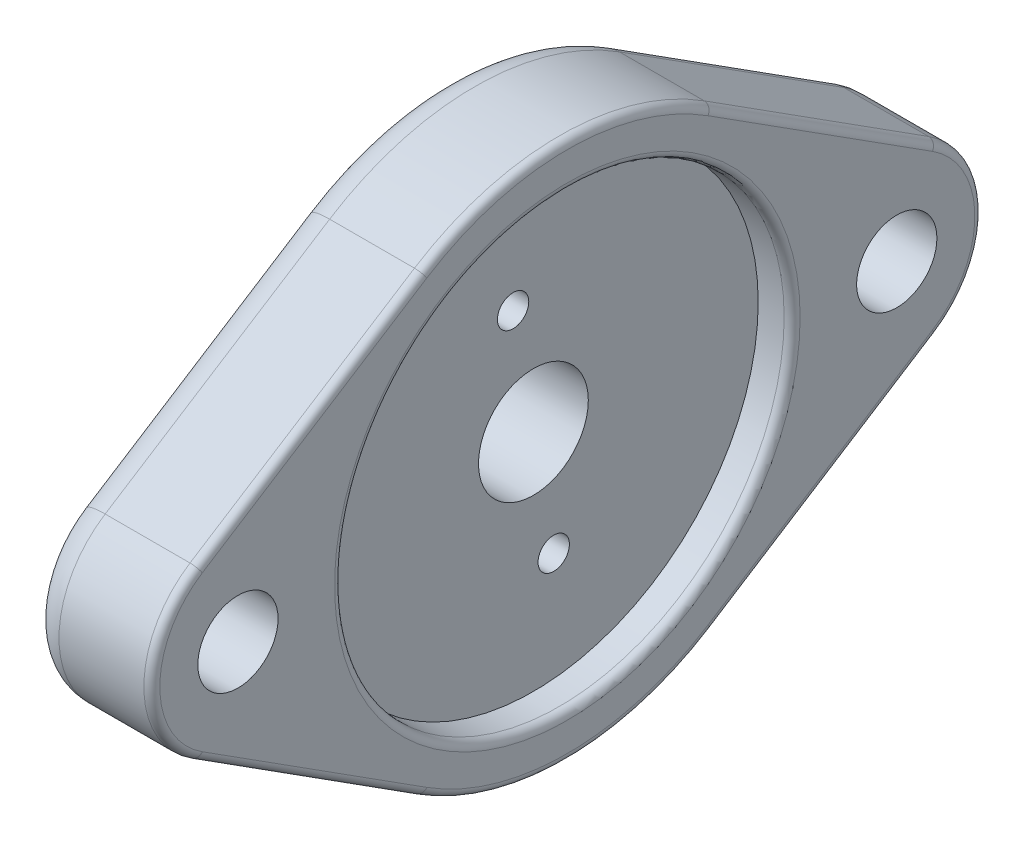
ISO-10303-21;
HEADER;
FILE_DESCRIPTION(('STEP AP214'),'2;1');
FILE_NAME('part.step','',(''),(''),'','','');
FILE_SCHEMA(('AUTOMOTIVE_DESIGN { 1 0 10303 214 1 1 1 1 }'));
ENDSEC;
DATA;
#1=APPLICATION_CONTEXT('core data for automotive mechanical design processes');
#2=APPLICATION_PROTOCOL_DEFINITION('international standard','automotive_design',2000,#1);
#3=PRODUCT_CONTEXT('',#1,'mechanical');
#4=PRODUCT('Part','Part','',(#3));
#5=PRODUCT_RELATED_PRODUCT_CATEGORY('part','',(#4));
#6=PRODUCT_DEFINITION_FORMATION('','',#4);
#7=PRODUCT_DEFINITION_CONTEXT('part definition',#1,'design');
#8=PRODUCT_DEFINITION('design','',#6,#7);
#9=PRODUCT_DEFINITION_SHAPE('','',#8);
#10=(LENGTH_UNIT() NAMED_UNIT(*) SI_UNIT(.MILLI.,.METRE.));
#11=(NAMED_UNIT(*) PLANE_ANGLE_UNIT() SI_UNIT($,.RADIAN.));
#12=(NAMED_UNIT(*) SI_UNIT($,.STERADIAN.) SOLID_ANGLE_UNIT());
#13=UNCERTAINTY_MEASURE_WITH_UNIT(LENGTH_MEASURE(1.E-05),#10,'distance_accuracy_value','');
#14=(GEOMETRIC_REPRESENTATION_CONTEXT(3) GLOBAL_UNCERTAINTY_ASSIGNED_CONTEXT((#13)) GLOBAL_UNIT_ASSIGNED_CONTEXT((#10,
#11,#12)) REPRESENTATION_CONTEXT('',''));
#15=CARTESIAN_POINT('',(0.,0.,0.));
#16=DIRECTION('',(0.,0.,1.));
#17=DIRECTION('',(1.,0.,0.));
#18=AXIS2_PLACEMENT_3D('',#15,#16,#17);
#19=CARTESIAN_POINT('',(0.,0.,0.));
#20=DIRECTION('',(1.,0.,0.));
#21=DIRECTION('',(0.,0.,-1.));
#22=AXIS2_PLACEMENT_3D('',#19,#20,#21);
#23=CYLINDRICAL_SURFACE('',#22,3.4925);
#24=CARTESIAN_POINT('',(0.,0.,0.));
#25=DIRECTION('',(1.,0.,0.));
#26=DIRECTION('',(0.,0.,-1.));
#27=AXIS2_PLACEMENT_3D('',#24,#25,#26);
#28=CIRCLE('',#27,3.4925);
#29=CARTESIAN_POINT('',(0.,0.,-3.4925));
#30=VERTEX_POINT('',#29);
#31=EDGE_CURVE('E314',#30,#30,#28,.T.);
#32=ORIENTED_EDGE('',*,*,#31,.F.);
#33=EDGE_LOOP('',(#32));
#34=FACE_BOUND('',#33,.T.);
#35=CARTESIAN_POINT('',(5.7785,0.,0.));
#36=DIRECTION('',(1.,0.,0.));
#37=DIRECTION('',(0.,0.,-1.));
#38=AXIS2_PLACEMENT_3D('',#35,#36,#37);
#39=CIRCLE('',#38,3.4925);
#40=CARTESIAN_POINT('',(5.7785,0.,-3.4925));
#41=VERTEX_POINT('',#40);
#42=EDGE_CURVE('E186',#41,#41,#39,.F.);
#43=ORIENTED_EDGE('',*,*,#42,.F.);
#44=EDGE_LOOP('',(#43));
#45=FACE_BOUND('',#44,.T.);
#46=ADVANCED_FACE('F34',(#34,#45),#23,.F.);
#47=CARTESIAN_POINT('',(7.9375,0.,0.));
#48=DIRECTION('',(-1.,0.,0.));
#49=DIRECTION('',(0.,0.,1.));
#50=AXIS2_PLACEMENT_3D('',#47,#48,#49);
#51=CYLINDRICAL_SURFACE('',#50,17.145);
#52=DIRECTION('',(-1.,0.,0.));
#53=VECTOR('',#52,1.);
#54=CARTESIAN_POINT('',(7.9375,14.4571064134333,9.21645805885674));
#55=LINE('',#54,#53);
#56=CARTESIAN_POINT('',(7.4295,14.4571064134333,9.21645805885674));
#57=VERTEX_POINT('',#56);
#58=CARTESIAN_POINT('',(2.032,14.4571064134333,9.21645805885674));
#59=VERTEX_POINT('',#58);
#60=EDGE_CURVE('E148',#57,#59,#55,.T.);
#61=ORIENTED_EDGE('',*,*,#60,.F.);
#62=CARTESIAN_POINT('',(7.4295,0.,0.));
#63=DIRECTION('',(1.,0.,0.));
#64=DIRECTION('',(0.,0.,-1.));
#65=AXIS2_PLACEMENT_3D('',#62,#63,#64);
#66=CIRCLE('',#65,17.145);
#67=CARTESIAN_POINT('',(7.4295,14.4571064134333,-9.21645805885674));
#68=VERTEX_POINT('',#67);
#69=EDGE_CURVE('E51',#57,#68,#66,.F.);
#70=ORIENTED_EDGE('',*,*,#69,.T.);
#71=DIRECTION('',(-1.,0.,0.));
#72=VECTOR('',#71,1.);
#73=CARTESIAN_POINT('',(7.9375,14.4571064134333,-9.21645805885674));
#74=LINE('',#73,#72);
#75=CARTESIAN_POINT('',(2.032,14.4571064134333,-9.21645805885674));
#76=VERTEX_POINT('',#75);
#77=EDGE_CURVE('E179',#68,#76,#74,.T.);
#78=ORIENTED_EDGE('',*,*,#77,.T.);
#79=CARTESIAN_POINT('',(2.032,0.,0.));
#80=DIRECTION('',(1.,0.,0.));
#81=DIRECTION('',(0.,0.,-1.));
#82=AXIS2_PLACEMENT_3D('',#79,#80,#81);
#83=CIRCLE('',#82,17.145);
#84=EDGE_CURVE('E156',#76,#59,#83,.T.);
#85=ORIENTED_EDGE('',*,*,#84,.T.);
#86=EDGE_LOOP('',(#61,#70,#78,#85));
#87=FACE_BOUND('',#86,.T.);
#88=ADVANCED_FACE('F178',(#87),#51,.T.);
#89=CARTESIAN_POINT('',(7.9375,14.4571064134333,9.21645805885674));
#90=DIRECTION('',(0.,-0.843225804224749,-0.537559525159331));
#91=DIRECTION('',(0.,0.537559525159331,-0.843225804224749));
#92=AXIS2_PLACEMENT_3D('',#89,#90,#91);
#93=PLANE('',#92);
#94=DIRECTION('',(-1.,0.,0.));
#95=VECTOR('',#94,1.);
#96=CARTESIAN_POINT('',(7.9375,5.35448385682716,23.495));
#97=LINE('',#96,#95);
#98=CARTESIAN_POINT('',(7.4295,5.35448385682716,23.495));
#99=VERTEX_POINT('',#98);
#100=CARTESIAN_POINT('',(2.032,5.35448385682716,23.495));
#101=VERTEX_POINT('',#100);
#102=EDGE_CURVE('E157',#99,#101,#97,.T.);
#103=ORIENTED_EDGE('',*,*,#102,.F.);
#104=DIRECTION('',(0.,-0.537559525159331,0.843225804224749));
#105=VECTOR('',#104,1.);
#106=CARTESIAN_POINT('',(7.4295,14.4571064134333,9.21645805885674));
#107=LINE('',#106,#105);
#108=EDGE_CURVE('E59',#99,#57,#107,.F.);
#109=ORIENTED_EDGE('',*,*,#108,.T.);
#110=ORIENTED_EDGE('',*,*,#60,.T.);
#111=DIRECTION('',(0.,-0.537559525159331,0.843225804224749));
#112=VECTOR('',#111,1.);
#113=CARTESIAN_POINT('',(2.032,14.4571064134333,9.21645805885674));
#114=LINE('',#113,#112);
#115=EDGE_CURVE('E152',#59,#101,#114,.T.);
#116=ORIENTED_EDGE('',*,*,#115,.T.);
#117=EDGE_LOOP('',(#103,#109,#110,#116));
#118=FACE_BOUND('',#117,.T.);
#119=ADVANCED_FACE('F150',(#118),#93,.F.);
#120=CARTESIAN_POINT('',(7.9375,0.,20.0814970152382));
#121=DIRECTION('',(-1.,0.,0.));
#122=DIRECTION('',(0.,0.,1.));
#123=AXIS2_PLACEMENT_3D('',#120,#121,#122);
#124=CYLINDRICAL_SURFACE('',#123,6.35);
#125=DIRECTION('',(-1.,0.,0.));
#126=VECTOR('',#125,1.);
#127=CARTESIAN_POINT('',(7.9375,-5.35448385682716,23.495));
#128=LINE('',#127,#126);
#129=CARTESIAN_POINT('',(7.4295,-5.35448385682716,23.495));
#130=VERTEX_POINT('',#129);
#131=CARTESIAN_POINT('',(2.032,-5.35448385682716,23.495));
#132=VERTEX_POINT('',#131);
#133=EDGE_CURVE('E301',#130,#132,#128,.T.);
#134=ORIENTED_EDGE('',*,*,#133,.F.);
#135=CARTESIAN_POINT('',(7.4295,0.,20.0814970152382));
#136=DIRECTION('',(1.,0.,0.));
#137=DIRECTION('',(0.,0.,-1.));
#138=AXIS2_PLACEMENT_3D('',#135,#136,#137);
#139=CIRCLE('',#138,6.35);
#140=EDGE_CURVE('E262',#130,#99,#139,.F.);
#141=ORIENTED_EDGE('',*,*,#140,.T.);
#142=ORIENTED_EDGE('',*,*,#102,.T.);
#143=CARTESIAN_POINT('',(2.032,0.,20.0814970152382));
#144=DIRECTION('',(1.,0.,0.));
#145=DIRECTION('',(0.,0.,-1.));
#146=AXIS2_PLACEMENT_3D('',#143,#144,#145);
#147=CIRCLE('',#146,6.35);
#148=EDGE_CURVE('E176',#101,#132,#147,.T.);
#149=ORIENTED_EDGE('',*,*,#148,.T.);
#150=EDGE_LOOP('',(#134,#141,#142,#149));
#151=FACE_BOUND('',#150,.T.);
#152=ADVANCED_FACE('F300',(#151),#124,.T.);
#153=CARTESIAN_POINT('',(7.9375,-5.35448385682716,23.495));
#154=DIRECTION('',(0.,0.843225804224749,-0.537559525159331));
#155=DIRECTION('',(0.,0.537559525159331,0.843225804224749));
#156=AXIS2_PLACEMENT_3D('',#153,#154,#155);
#157=PLANE('',#156);
#158=DIRECTION('',(-1.,0.,0.));
#159=VECTOR('',#158,1.);
#160=CARTESIAN_POINT('',(7.9375,-14.4571064134333,9.21645805885674));
#161=LINE('',#160,#159);
#162=CARTESIAN_POINT('',(7.4295,-14.4571064134333,9.21645805885674));
#163=VERTEX_POINT('',#162);
#164=CARTESIAN_POINT('',(2.032,-14.4571064134333,9.21645805885674));
#165=VERTEX_POINT('',#164);
#166=EDGE_CURVE('E303',#163,#165,#161,.T.);
#167=ORIENTED_EDGE('',*,*,#166,.F.);
#168=DIRECTION('',(0.,-0.537559525159331,-0.843225804224749));
#169=VECTOR('',#168,1.);
#170=CARTESIAN_POINT('',(7.4295,-5.35448385682715,23.495));
#171=LINE('',#170,#169);
#172=EDGE_CURVE('E260',#163,#130,#171,.F.);
#173=ORIENTED_EDGE('',*,*,#172,.T.);
#174=ORIENTED_EDGE('',*,*,#133,.T.);
#175=DIRECTION('',(0.,-0.537559525159331,-0.843225804224749));
#176=VECTOR('',#175,1.);
#177=CARTESIAN_POINT('',(2.032,-5.35448385682716,23.495));
#178=LINE('',#177,#176);
#179=EDGE_CURVE('E211',#132,#165,#178,.T.);
#180=ORIENTED_EDGE('',*,*,#179,.T.);
#181=EDGE_LOOP('',(#167,#173,#174,#180));
#182=FACE_BOUND('',#181,.T.);
#183=ADVANCED_FACE('F402',(#182),#157,.F.);
#184=CARTESIAN_POINT('',(7.9375,0.,0.));
#185=DIRECTION('',(-1.,0.,0.));
#186=DIRECTION('',(0.,0.,1.));
#187=AXIS2_PLACEMENT_3D('',#184,#185,#186);
#188=CYLINDRICAL_SURFACE('',#187,17.145);
#189=DIRECTION('',(-1.,0.,0.));
#190=VECTOR('',#189,1.);
#191=CARTESIAN_POINT('',(7.9375,-14.4571064134333,-9.21645805885674));
#192=LINE('',#191,#190);
#193=CARTESIAN_POINT('',(7.4295,-14.4571064134333,-9.21645805885674));
#194=VERTEX_POINT('',#193);
#195=CARTESIAN_POINT('',(2.032,-14.4571064134333,-9.21645805885674));
#196=VERTEX_POINT('',#195);
#197=EDGE_CURVE('E307',#194,#196,#192,.T.);
#198=ORIENTED_EDGE('',*,*,#197,.F.);
#199=CARTESIAN_POINT('',(7.4295,0.,0.));
#200=DIRECTION('',(1.,0.,0.));
#201=DIRECTION('',(0.,0.,-1.));
#202=AXIS2_PLACEMENT_3D('',#199,#200,#201);
#203=CIRCLE('',#202,17.145);
#204=EDGE_CURVE('E258',#194,#163,#203,.F.);
#205=ORIENTED_EDGE('',*,*,#204,.T.);
#206=ORIENTED_EDGE('',*,*,#166,.T.);
#207=CARTESIAN_POINT('',(2.032,0.,0.));
#208=DIRECTION('',(1.,0.,0.));
#209=DIRECTION('',(0.,0.,-1.));
#210=AXIS2_PLACEMENT_3D('',#207,#208,#209);
#211=CIRCLE('',#210,17.145);
#212=EDGE_CURVE('E208',#165,#196,#211,.T.);
#213=ORIENTED_EDGE('',*,*,#212,.T.);
#214=EDGE_LOOP('',(#198,#205,#206,#213));
#215=FACE_BOUND('',#214,.T.);
#216=ADVANCED_FACE('F398',(#215),#188,.T.);
#217=CARTESIAN_POINT('',(7.9375,-5.35448385682715,-23.495));
#218=DIRECTION('',(0.,0.843225804224749,0.537559525159331));
#219=DIRECTION('',(0.,-0.537559525159331,0.843225804224749));
#220=AXIS2_PLACEMENT_3D('',#217,#218,#219);
#221=PLANE('',#220);
#222=DIRECTION('',(-1.,0.,0.));
#223=VECTOR('',#222,1.);
#224=CARTESIAN_POINT('',(7.9375,-5.35448385682715,-23.495));
#225=LINE('',#224,#223);
#226=CARTESIAN_POINT('',(7.4295,-5.35448385682715,-23.495));
#227=VERTEX_POINT('',#226);
#228=CARTESIAN_POINT('',(2.032,-5.35448385682715,-23.495));
#229=VERTEX_POINT('',#228);
#230=EDGE_CURVE('E309',#227,#229,#225,.T.);
#231=ORIENTED_EDGE('',*,*,#230,.F.);
#232=DIRECTION('',(0.,0.537559525159331,-0.843225804224749));
#233=VECTOR('',#232,1.);
#234=CARTESIAN_POINT('',(7.4295,-14.4571064134333,-9.21645805885674));
#235=LINE('',#234,#233);
#236=EDGE_CURVE('E256',#227,#194,#235,.F.);
#237=ORIENTED_EDGE('',*,*,#236,.T.);
#238=ORIENTED_EDGE('',*,*,#197,.T.);
#239=DIRECTION('',(0.,0.537559525159331,-0.843225804224749));
#240=VECTOR('',#239,1.);
#241=CARTESIAN_POINT('',(2.032,-5.35448385682715,-23.495));
#242=LINE('',#241,#240);
#243=EDGE_CURVE('E205',#196,#229,#242,.T.);
#244=ORIENTED_EDGE('',*,*,#243,.T.);
#245=EDGE_LOOP('',(#231,#237,#238,#244));
#246=FACE_BOUND('',#245,.T.);
#247=ADVANCED_FACE('F394',(#246),#221,.F.);
#248=CARTESIAN_POINT('',(7.9375,0.,-20.0814970152382));
#249=DIRECTION('',(-1.,0.,0.));
#250=DIRECTION('',(0.,0.,1.));
#251=AXIS2_PLACEMENT_3D('',#248,#249,#250);
#252=CYLINDRICAL_SURFACE('',#251,6.35);
#253=DIRECTION('',(-1.,0.,0.));
#254=VECTOR('',#253,1.);
#255=CARTESIAN_POINT('',(7.9375,5.35448385682715,-23.495));
#256=LINE('',#255,#254);
#257=CARTESIAN_POINT('',(7.4295,5.35448385682715,-23.495));
#258=VERTEX_POINT('',#257);
#259=CARTESIAN_POINT('',(2.032,5.35448385682715,-23.495));
#260=VERTEX_POINT('',#259);
#261=EDGE_CURVE('E311',#258,#260,#256,.T.);
#262=ORIENTED_EDGE('',*,*,#261,.F.);
#263=CARTESIAN_POINT('',(7.4295,0.,-20.0814970152382));
#264=DIRECTION('',(1.,0.,0.));
#265=DIRECTION('',(0.,0.,-1.));
#266=AXIS2_PLACEMENT_3D('',#263,#264,#265);
#267=CIRCLE('',#266,6.35);
#268=EDGE_CURVE('E253',#258,#227,#267,.F.);
#269=ORIENTED_EDGE('',*,*,#268,.T.);
#270=ORIENTED_EDGE('',*,*,#230,.T.);
#271=CARTESIAN_POINT('',(2.032,0.,-20.0814970152382));
#272=DIRECTION('',(1.,0.,0.));
#273=DIRECTION('',(0.,0.,-1.));
#274=AXIS2_PLACEMENT_3D('',#271,#272,#273);
#275=CIRCLE('',#274,6.35);
#276=EDGE_CURVE('E202',#229,#260,#275,.T.);
#277=ORIENTED_EDGE('',*,*,#276,.T.);
#278=EDGE_LOOP('',(#262,#269,#270,#277));
#279=FACE_BOUND('',#278,.T.);
#280=ADVANCED_FACE('F390',(#279),#252,.T.);
#281=CARTESIAN_POINT('',(7.9375,14.4571064134333,-9.21645805885674));
#282=DIRECTION('',(0.,-0.843225804224749,0.537559525159331));
#283=DIRECTION('',(0.,-0.537559525159331,-0.843225804224749));
#284=AXIS2_PLACEMENT_3D('',#281,#282,#283);
#285=PLANE('',#284);
#286=ORIENTED_EDGE('',*,*,#77,.F.);
#287=DIRECTION('',(0.,0.537559525159331,0.843225804224749));
#288=VECTOR('',#287,1.);
#289=CARTESIAN_POINT('',(7.4295,5.35448385682715,-23.495));
#290=LINE('',#289,#288);
#291=EDGE_CURVE('E43',#68,#258,#290,.F.);
#292=ORIENTED_EDGE('',*,*,#291,.T.);
#293=ORIENTED_EDGE('',*,*,#261,.T.);
#294=DIRECTION('',(0.,0.537559525159331,0.843225804224749));
#295=VECTOR('',#294,1.);
#296=CARTESIAN_POINT('',(2.032,14.4571064134333,-9.21645805885674));
#297=LINE('',#296,#295);
#298=EDGE_CURVE('E200',#260,#76,#297,.T.);
#299=ORIENTED_EDGE('',*,*,#298,.T.);
#300=EDGE_LOOP('',(#286,#292,#293,#299));
#301=FACE_BOUND('',#300,.T.);
#302=ADVANCED_FACE('F350',(#301),#285,.F.);
#303=CARTESIAN_POINT('',(7.9375,0.,0.));
#304=DIRECTION('',(1.,0.,0.));
#305=DIRECTION('',(0.,0.,-1.));
#306=AXIS2_PLACEMENT_3D('',#303,#304,#305);
#307=PLANE('',#306);
#308=DIRECTION('',(0.,0.537559525159331,-0.843225804224749));
#309=VECTOR('',#308,1.);
#310=CARTESIAN_POINT('',(7.9375,-4.92612514828098,-23.2219197612191));
#311=LINE('',#310,#309);
#312=CARTESIAN_POINT('',(7.9375,-14.0287477048871,-8.9433778200758));
#313=VERTEX_POINT('',#312);
#314=CARTESIAN_POINT('',(7.9375,-4.92612514828098,-23.2219197612191));
#315=VERTEX_POINT('',#314);
#316=EDGE_CURVE('E248',#313,#315,#311,.T.);
#317=ORIENTED_EDGE('',*,*,#316,.T.);
#318=CARTESIAN_POINT('',(7.9375,0.,-20.0814970152382));
#319=DIRECTION('',(1.,0.,0.));
#320=DIRECTION('',(0.,0.,-1.));
#321=AXIS2_PLACEMENT_3D('',#318,#319,#320);
#322=CIRCLE('',#321,5.842);
#323=CARTESIAN_POINT('',(7.9375,4.92612514828099,-23.2219197612191));
#324=VERTEX_POINT('',#323);
#325=EDGE_CURVE('E250',#315,#324,#322,.T.);
#326=ORIENTED_EDGE('',*,*,#325,.T.);
#327=DIRECTION('',(0.,0.537559525159331,0.843225804224749));
#328=VECTOR('',#327,1.);
#329=CARTESIAN_POINT('',(7.9375,14.0287477048871,-8.9433778200758));
#330=LINE('',#329,#328);
#331=CARTESIAN_POINT('',(7.9375,14.0287477048871,-8.9433778200758));
#332=VERTEX_POINT('',#331);
#333=EDGE_CURVE('E236',#324,#332,#330,.T.);
#334=ORIENTED_EDGE('',*,*,#333,.T.);
#335=CARTESIAN_POINT('',(7.9375,0.,0.));
#336=DIRECTION('',(1.,0.,0.));
#337=DIRECTION('',(0.,0.,-1.));
#338=AXIS2_PLACEMENT_3D('',#335,#336,#337);
#339=CIRCLE('',#338,16.637);
#340=CARTESIAN_POINT('',(7.9375,14.0287477048871,8.9433778200758));
#341=VERTEX_POINT('',#340);
#342=EDGE_CURVE('E238',#332,#341,#339,.T.);
#343=ORIENTED_EDGE('',*,*,#342,.T.);
#344=DIRECTION('',(0.,-0.537559525159331,0.843225804224749));
#345=VECTOR('',#344,1.);
#346=CARTESIAN_POINT('',(7.9375,4.92612514828098,23.2219197612191));
#347=LINE('',#346,#345);
#348=CARTESIAN_POINT('',(7.9375,4.92612514828098,23.2219197612191));
#349=VERTEX_POINT('',#348);
#350=EDGE_CURVE('E240',#341,#349,#347,.T.);
#351=ORIENTED_EDGE('',*,*,#350,.T.);
#352=CARTESIAN_POINT('',(7.9375,0.,20.0814970152382));
#353=DIRECTION('',(1.,0.,0.));
#354=DIRECTION('',(0.,0.,-1.));
#355=AXIS2_PLACEMENT_3D('',#352,#353,#354);
#356=CIRCLE('',#355,5.842);
#357=CARTESIAN_POINT('',(7.9375,-4.92612514828098,23.2219197612191));
#358=VERTEX_POINT('',#357);
#359=EDGE_CURVE('E242',#349,#358,#356,.T.);
#360=ORIENTED_EDGE('',*,*,#359,.T.);
#361=DIRECTION('',(0.,-0.537559525159331,-0.843225804224749));
#362=VECTOR('',#361,1.);
#363=CARTESIAN_POINT('',(7.9375,-14.0287477048871,8.9433778200758));
#364=LINE('',#363,#362);
#365=CARTESIAN_POINT('',(7.9375,-14.0287477048871,8.9433778200758));
#366=VERTEX_POINT('',#365);
#367=EDGE_CURVE('E244',#358,#366,#364,.T.);
#368=ORIENTED_EDGE('',*,*,#367,.T.);
#369=CARTESIAN_POINT('',(7.9375,0.,0.));
#370=DIRECTION('',(1.,0.,0.));
#371=DIRECTION('',(0.,0.,-1.));
#372=AXIS2_PLACEMENT_3D('',#369,#370,#371);
#373=CIRCLE('',#372,16.637);
#374=EDGE_CURVE('E246',#366,#313,#373,.T.);
#375=ORIENTED_EDGE('',*,*,#374,.T.);
#376=EDGE_LOOP('',(#317,#326,#334,#343,#351,#360,#368,#375));
#377=FACE_BOUND('',#376,.T.);
#378=CARTESIAN_POINT('',(7.9375,0.,0.));
#379=DIRECTION('',(1.,0.,0.));
#380=DIRECTION('',(0.,0.,-1.));
#381=AXIS2_PLACEMENT_3D('',#378,#379,#380);
#382=CIRCLE('',#381,14.8082);
#383=CARTESIAN_POINT('',(7.9375,0.,-14.8082));
#384=VERTEX_POINT('',#383);
#385=EDGE_CURVE('E175',#384,#384,#382,.F.);
#386=ORIENTED_EDGE('',*,*,#385,.T.);
#387=EDGE_LOOP('',(#386));
#388=FACE_BOUND('',#387,.T.);
#389=CARTESIAN_POINT('',(7.9375,0.,20.955));
#390=DIRECTION('',(1.,0.,0.));
#391=DIRECTION('',(0.,0.,-1.));
#392=AXIS2_PLACEMENT_3D('',#389,#390,#391);
#393=CIRCLE('',#392,2.5527);
#394=CARTESIAN_POINT('',(7.9375,0.,18.4023));
#395=VERTEX_POINT('',#394);
#396=EDGE_CURVE('E233',#395,#395,#393,.T.);
#397=ORIENTED_EDGE('',*,*,#396,.F.);
#398=EDGE_LOOP('',(#397));
#399=FACE_BOUND('',#398,.T.);
#400=CARTESIAN_POINT('',(7.9375,0.,-20.955));
#401=DIRECTION('',(1.,0.,0.));
#402=DIRECTION('',(0.,0.,-1.));
#403=AXIS2_PLACEMENT_3D('',#400,#401,#402);
#404=CIRCLE('',#403,2.5527);
#405=CARTESIAN_POINT('',(7.9375,0.,-23.5077));
#406=VERTEX_POINT('',#405);
#407=EDGE_CURVE('E335',#406,#406,#404,.T.);
#408=ORIENTED_EDGE('',*,*,#407,.F.);
#409=EDGE_LOOP('',(#408));
#410=FACE_BOUND('',#409,.T.);
#411=ADVANCED_FACE('F346',(#377,#388,#399,#410),#307,.T.);
#412=CARTESIAN_POINT('',(0.,0.,0.));
#413=DIRECTION('',(1.,0.,0.));
#414=DIRECTION('',(0.,0.,-1.));
#415=AXIS2_PLACEMENT_3D('',#412,#413,#414);
#416=PLANE('',#415);
#417=DIRECTION('',(0.,-0.537559525159331,0.843225804224749));
#418=VECTOR('',#417,1.);
#419=CARTESIAN_POINT('',(0.,12.7436715792486,8.12413710373297));
#420=LINE('',#419,#418);
#421=CARTESIAN_POINT('',(0.,3.64104902264246,22.4026790448762));
#422=VERTEX_POINT('',#421);
#423=CARTESIAN_POINT('',(0.,12.7436715792486,8.12413710373297));
#424=VERTEX_POINT('',#423);
#425=EDGE_CURVE('E181',#422,#424,#420,.F.);
#426=ORIENTED_EDGE('',*,*,#425,.T.);
#427=CARTESIAN_POINT('',(0.,0.,0.));
#428=DIRECTION('',(1.,0.,0.));
#429=DIRECTION('',(0.,0.,-1.));
#430=AXIS2_PLACEMENT_3D('',#427,#428,#429);
#431=CIRCLE('',#430,15.113);
#432=CARTESIAN_POINT('',(0.,12.7436715792486,-8.12413710373298));
#433=VERTEX_POINT('',#432);
#434=EDGE_CURVE('E166',#424,#433,#431,.F.);
#435=ORIENTED_EDGE('',*,*,#434,.T.);
#436=DIRECTION('',(0.,0.537559525159331,0.843225804224749));
#437=VECTOR('',#436,1.);
#438=CARTESIAN_POINT('',(0.,12.7436715792486,-8.12413710373297));
#439=LINE('',#438,#437);
#440=CARTESIAN_POINT('',(0.,3.64104902264247,-22.4026790448762));
#441=VERTEX_POINT('',#440);
#442=EDGE_CURVE('E197',#433,#441,#439,.F.);
#443=ORIENTED_EDGE('',*,*,#442,.T.);
#444=CARTESIAN_POINT('',(0.,0.,-20.0814970152382));
#445=DIRECTION('',(1.,0.,0.));
#446=DIRECTION('',(0.,0.,-1.));
#447=AXIS2_PLACEMENT_3D('',#444,#445,#446);
#448=CIRCLE('',#447,4.318);
#449=CARTESIAN_POINT('',(0.,-3.64104902264246,-22.4026790448762));
#450=VERTEX_POINT('',#449);
#451=EDGE_CURVE('E195',#441,#450,#448,.F.);
#452=ORIENTED_EDGE('',*,*,#451,.T.);
#453=DIRECTION('',(0.,0.537559525159331,-0.843225804224749));
#454=VECTOR('',#453,1.);
#455=CARTESIAN_POINT('',(0.,-12.7436715792486,-8.12413710373297));
#456=LINE('',#455,#454);
#457=CARTESIAN_POINT('',(0.,-12.7436715792486,-8.12413710373298));
#458=VERTEX_POINT('',#457);
#459=EDGE_CURVE('E193',#450,#458,#456,.F.);
#460=ORIENTED_EDGE('',*,*,#459,.T.);
#461=CARTESIAN_POINT('',(0.,0.,0.));
#462=DIRECTION('',(1.,0.,0.));
#463=DIRECTION('',(0.,0.,-1.));
#464=AXIS2_PLACEMENT_3D('',#461,#462,#463);
#465=CIRCLE('',#464,15.113);
#466=CARTESIAN_POINT('',(0.,-12.7436715792486,8.12413710373298));
#467=VERTEX_POINT('',#466);
#468=EDGE_CURVE('E191',#458,#467,#465,.F.);
#469=ORIENTED_EDGE('',*,*,#468,.T.);
#470=DIRECTION('',(0.,-0.537559525159331,-0.843225804224749));
#471=VECTOR('',#470,1.);
#472=CARTESIAN_POINT('',(0.,-12.7436715792486,8.12413710373297));
#473=LINE('',#472,#471);
#474=CARTESIAN_POINT('',(0.,-3.64104902264247,22.4026790448762));
#475=VERTEX_POINT('',#474);
#476=EDGE_CURVE('E189',#467,#475,#473,.F.);
#477=ORIENTED_EDGE('',*,*,#476,.T.);
#478=CARTESIAN_POINT('',(0.,0.,20.0814970152382));
#479=DIRECTION('',(1.,0.,0.));
#480=DIRECTION('',(0.,0.,-1.));
#481=AXIS2_PLACEMENT_3D('',#478,#479,#480);
#482=CIRCLE('',#481,4.318);
#483=EDGE_CURVE('E183',#475,#422,#482,.F.);
#484=ORIENTED_EDGE('',*,*,#483,.T.);
#485=EDGE_LOOP('',(#426,#435,#443,#452,#460,#469,#477,#484));
#486=FACE_BOUND('',#485,.T.);
#487=CARTESIAN_POINT('',(0.,0.,20.955));
#488=DIRECTION('',(1.,0.,0.));
#489=DIRECTION('',(0.,0.,-1.));
#490=AXIS2_PLACEMENT_3D('',#487,#488,#489);
#491=CIRCLE('',#490,2.5527);
#492=CARTESIAN_POINT('',(0.,0.,18.4023));
#493=VERTEX_POINT('',#492);
#494=EDGE_CURVE('E338',#493,#493,#491,.T.);
#495=ORIENTED_EDGE('',*,*,#494,.T.);
#496=EDGE_LOOP('',(#495));
#497=FACE_BOUND('',#496,.T.);
#498=CARTESIAN_POINT('',(0.,0.,-20.955));
#499=DIRECTION('',(1.,0.,0.));
#500=DIRECTION('',(0.,0.,-1.));
#501=AXIS2_PLACEMENT_3D('',#498,#499,#500);
#502=CIRCLE('',#501,2.5527);
#503=CARTESIAN_POINT('',(0.,0.,-23.5077));
#504=VERTEX_POINT('',#503);
#505=EDGE_CURVE('E332',#504,#504,#502,.T.);
#506=ORIENTED_EDGE('',*,*,#505,.T.);
#507=EDGE_LOOP('',(#506));
#508=FACE_BOUND('',#507,.T.);
#509=CARTESIAN_POINT('',(0.,7.32913625946746,1.29232446783284));
#510=DIRECTION('',(1.,0.,0.));
#511=DIRECTION('',(0.,0.,-1.));
#512=AXIS2_PLACEMENT_3D('',#509,#510,#511);
#513=CIRCLE('',#512,0.996949999999999);
#514=CARTESIAN_POINT('',(0.,7.32913625946746,0.295374467832837));
#515=VERTEX_POINT('',#514);
#516=EDGE_CURVE('E326',#515,#515,#513,.T.);
#517=ORIENTED_EDGE('',*,*,#516,.T.);
#518=EDGE_LOOP('',(#517));
#519=FACE_BOUND('',#518,.T.);
#520=CARTESIAN_POINT('',(0.,-7.32913625946746,-1.29232446783284));
#521=DIRECTION('',(1.,0.,0.));
#522=DIRECTION('',(0.,0.,-1.));
#523=AXIS2_PLACEMENT_3D('',#520,#521,#522);
#524=CIRCLE('',#523,0.996949999999999);
#525=CARTESIAN_POINT('',(0.,-7.32913625946746,-2.28927446783284));
#526=VERTEX_POINT('',#525);
#527=EDGE_CURVE('E320',#526,#526,#524,.T.);
#528=ORIENTED_EDGE('',*,*,#527,.T.);
#529=EDGE_LOOP('',(#528));
#530=FACE_BOUND('',#529,.T.);
#531=ORIENTED_EDGE('',*,*,#31,.T.);
#532=EDGE_LOOP('',(#531));
#533=FACE_BOUND('',#532,.T.);
#534=ADVANCED_FACE('F349',(#486,#497,#508,#519,#530,#533),#416,.F.);
#535=CARTESIAN_POINT('',(5.7785,0.,0.));
#536=DIRECTION('',(1.,0.,0.));
#537=DIRECTION('',(0.,0.,-1.));
#538=AXIS2_PLACEMENT_3D('',#535,#536,#537);
#539=PLANE('',#538);
#540=CARTESIAN_POINT('',(5.7785,7.32913625946746,1.29232446783284));
#541=DIRECTION('',(1.,0.,0.));
#542=DIRECTION('',(0.,0.,-1.));
#543=AXIS2_PLACEMENT_3D('',#540,#541,#542);
#544=CIRCLE('',#543,0.996949999999999);
#545=CARTESIAN_POINT('',(5.7785,7.32913625946746,0.295374467832837));
#546=VERTEX_POINT('',#545);
#547=EDGE_CURVE('E329',#546,#546,#544,.T.);
#548=ORIENTED_EDGE('',*,*,#547,.F.);
#549=EDGE_LOOP('',(#548));
#550=FACE_BOUND('',#549,.T.);
#551=CARTESIAN_POINT('',(5.7785,-7.32913625946746,-1.29232446783284));
#552=DIRECTION('',(1.,0.,0.));
#553=DIRECTION('',(0.,0.,-1.));
#554=AXIS2_PLACEMENT_3D('',#551,#552,#553);
#555=CIRCLE('',#554,0.99695);
#556=CARTESIAN_POINT('',(5.7785,-7.32913625946746,-2.28927446783284));
#557=VERTEX_POINT('',#556);
#558=EDGE_CURVE('E323',#557,#557,#555,.T.);
#559=ORIENTED_EDGE('',*,*,#558,.F.);
#560=EDGE_LOOP('',(#559));
#561=FACE_BOUND('',#560,.T.);
#562=CARTESIAN_POINT('',(5.7785,0.,0.));
#563=DIRECTION('',(1.,0.,0.));
#564=DIRECTION('',(0.,0.,-1.));
#565=AXIS2_PLACEMENT_3D('',#562,#563,#564);
#566=CIRCLE('',#565,14.3002);
#567=CARTESIAN_POINT('',(5.7785,0.,-14.3002));
#568=VERTEX_POINT('',#567);
#569=EDGE_CURVE('E317',#568,#568,#566,.T.);
#570=ORIENTED_EDGE('',*,*,#569,.T.);
#571=EDGE_LOOP('',(#570));
#572=FACE_BOUND('',#571,.T.);
#573=ORIENTED_EDGE('',*,*,#42,.T.);
#574=EDGE_LOOP('',(#573));
#575=FACE_BOUND('',#574,.T.);
#576=ADVANCED_FACE('F386',(#550,#561,#572,#575),#539,.T.);
#577=CARTESIAN_POINT('',(5.7785,0.,0.));
#578=DIRECTION('',(1.,0.,0.));
#579=DIRECTION('',(0.,0.,-1.));
#580=AXIS2_PLACEMENT_3D('',#577,#578,#579);
#581=CYLINDRICAL_SURFACE('',#580,14.3002);
#582=CARTESIAN_POINT('',(7.4295,0.,0.));
#583=DIRECTION('',(1.,0.,0.));
#584=DIRECTION('',(0.,0.,-1.));
#585=AXIS2_PLACEMENT_3D('',#582,#583,#584);
#586=CIRCLE('',#585,14.3002);
#587=CARTESIAN_POINT('',(7.4295,0.,-14.3002));
#588=VERTEX_POINT('',#587);
#589=EDGE_CURVE('E11',#588,#588,#586,.T.);
#590=ORIENTED_EDGE('',*,*,#589,.T.);
#591=EDGE_LOOP('',(#590));
#592=FACE_BOUND('',#591,.T.);
#593=ORIENTED_EDGE('',*,*,#569,.F.);
#594=EDGE_LOOP('',(#593));
#595=FACE_BOUND('',#594,.T.);
#596=ADVANCED_FACE('F381',(#592,#595),#581,.F.);
#597=CARTESIAN_POINT('',(5.7785,-7.32913625946746,-1.29232446783284));
#598=DIRECTION('',(1.,0.,0.));
#599=DIRECTION('',(0.,0.,-1.));
#600=AXIS2_PLACEMENT_3D('',#597,#598,#599);
#601=CYLINDRICAL_SURFACE('',#600,0.996949999999999);
#602=ORIENTED_EDGE('',*,*,#527,.F.);
#603=EDGE_LOOP('',(#602));
#604=FACE_BOUND('',#603,.T.);
#605=ORIENTED_EDGE('',*,*,#558,.T.);
#606=EDGE_LOOP('',(#605));
#607=FACE_BOUND('',#606,.T.);
#608=ADVANCED_FACE('F367',(#604,#607),#601,.F.);
#609=CARTESIAN_POINT('',(5.7785,7.32913625946746,1.29232446783284));
#610=DIRECTION('',(1.,0.,0.));
#611=DIRECTION('',(0.,0.,-1.));
#612=AXIS2_PLACEMENT_3D('',#609,#610,#611);
#613=CYLINDRICAL_SURFACE('',#612,0.996949999999999);
#614=ORIENTED_EDGE('',*,*,#516,.F.);
#615=EDGE_LOOP('',(#614));
#616=FACE_BOUND('',#615,.T.);
#617=ORIENTED_EDGE('',*,*,#547,.T.);
#618=EDGE_LOOP('',(#617));
#619=FACE_BOUND('',#618,.T.);
#620=ADVANCED_FACE('F357',(#616,#619),#613,.F.);
#621=CARTESIAN_POINT('',(7.9375,0.,-20.955));
#622=DIRECTION('',(1.,0.,0.));
#623=DIRECTION('',(0.,0.,-1.));
#624=AXIS2_PLACEMENT_3D('',#621,#622,#623);
#625=CYLINDRICAL_SURFACE('',#624,2.5527);
#626=ORIENTED_EDGE('',*,*,#505,.F.);
#627=EDGE_LOOP('',(#626));
#628=FACE_BOUND('',#627,.T.);
#629=ORIENTED_EDGE('',*,*,#407,.T.);
#630=EDGE_LOOP('',(#629));
#631=FACE_BOUND('',#630,.T.);
#632=ADVANCED_FACE('F355',(#628,#631),#625,.F.);
#633=CARTESIAN_POINT('',(7.9375,0.,20.955));
#634=DIRECTION('',(1.,0.,0.));
#635=DIRECTION('',(0.,0.,-1.));
#636=AXIS2_PLACEMENT_3D('',#633,#634,#635);
#637=CYLINDRICAL_SURFACE('',#636,2.5527);
#638=ORIENTED_EDGE('',*,*,#494,.F.);
#639=EDGE_LOOP('',(#638));
#640=FACE_BOUND('',#639,.T.);
#641=ORIENTED_EDGE('',*,*,#396,.T.);
#642=EDGE_LOOP('',(#641));
#643=FACE_BOUND('',#642,.T.);
#644=ADVANCED_FACE('F344',(#640,#643),#637,.F.);
#645=CARTESIAN_POINT('',(2.032,0.,0.));
#646=DIRECTION('',(1.,0.,0.));
#647=DIRECTION('',(0.,0.,-1.));
#648=AXIS2_PLACEMENT_3D('',#645,#646,#647);
#649=TOROIDAL_SURFACE('',#648,15.113,2.032);
#650=CARTESIAN_POINT('',(2.032,-12.7436715792486,8.12413710373298));
#651=DIRECTION('',(0.,0.537559525159332,0.843225804224748));
#652=DIRECTION('',(0.,-0.843225804224748,0.537559525159332));
#653=AXIS2_PLACEMENT_3D('',#650,#651,#652);
#654=CIRCLE('',#653,2.032);
#655=EDGE_CURVE('E227',#467,#165,#654,.T.);
#656=ORIENTED_EDGE('',*,*,#655,.F.);
#657=ORIENTED_EDGE('',*,*,#468,.F.);
#658=CARTESIAN_POINT('',(2.032,-12.7436715792486,-8.12413710373298));
#659=DIRECTION('',(0.,0.537559525159331,-0.843225804224749));
#660=DIRECTION('',(0.,0.843225804224749,0.537559525159332));
#661=AXIS2_PLACEMENT_3D('',#658,#659,#660);
#662=CIRCLE('',#661,2.032);
#663=EDGE_CURVE('E230',#196,#458,#662,.T.);
#664=ORIENTED_EDGE('',*,*,#663,.F.);
#665=ORIENTED_EDGE('',*,*,#212,.F.);
#666=EDGE_LOOP('',(#656,#657,#664,#665));
#667=FACE_BOUND('',#666,.T.);
#668=ADVANCED_FACE('F364',(#667),#649,.T.);
#669=CARTESIAN_POINT('',(2.032,-3.64104902264246,-22.4026790448762));
#670=DIRECTION('',(0.,0.537559525159331,-0.843225804224749));
#671=DIRECTION('',(0.,0.843225804224749,0.537559525159331));
#672=AXIS2_PLACEMENT_3D('',#669,#670,#671);
#673=CYLINDRICAL_SURFACE('',#672,2.032);
#674=ORIENTED_EDGE('',*,*,#663,.T.);
#675=ORIENTED_EDGE('',*,*,#459,.F.);
#676=CARTESIAN_POINT('',(2.032,-3.64104902264246,-22.4026790448762));
#677=DIRECTION('',(0.,0.537559525159332,-0.843225804224748));
#678=DIRECTION('',(0.,0.843225804224748,0.537559525159332));
#679=AXIS2_PLACEMENT_3D('',#676,#677,#678);
#680=CIRCLE('',#679,2.032);
#681=EDGE_CURVE('E224',#229,#450,#680,.T.);
#682=ORIENTED_EDGE('',*,*,#681,.F.);
#683=ORIENTED_EDGE('',*,*,#243,.F.);
#684=EDGE_LOOP('',(#674,#675,#682,#683));
#685=FACE_BOUND('',#684,.T.);
#686=ADVANCED_FACE('F430',(#685),#673,.T.);
#687=CARTESIAN_POINT('',(2.032,-3.64104902264247,22.4026790448762));
#688=DIRECTION('',(0.,-0.537559525159331,-0.843225804224749));
#689=DIRECTION('',(0.,0.843225804224749,-0.537559525159331));
#690=AXIS2_PLACEMENT_3D('',#687,#688,#689);
#691=CYLINDRICAL_SURFACE('',#690,2.032);
#692=ORIENTED_EDGE('',*,*,#655,.T.);
#693=ORIENTED_EDGE('',*,*,#179,.F.);
#694=CARTESIAN_POINT('',(2.032,-3.64104902264247,22.4026790448762));
#695=DIRECTION('',(0.,0.537559525159331,0.843225804224749));
#696=DIRECTION('',(0.,-0.843225804224749,0.537559525159332));
#697=AXIS2_PLACEMENT_3D('',#694,#695,#696);
#698=CIRCLE('',#697,2.032);
#699=EDGE_CURVE('E221',#475,#132,#698,.T.);
#700=ORIENTED_EDGE('',*,*,#699,.F.);
#701=ORIENTED_EDGE('',*,*,#476,.F.);
#702=EDGE_LOOP('',(#692,#693,#700,#701));
#703=FACE_BOUND('',#702,.T.);
#704=ADVANCED_FACE('F426',(#703),#691,.T.);
#705=CARTESIAN_POINT('',(2.032,0.,-20.0814970152382));
#706=DIRECTION('',(1.,0.,0.));
#707=DIRECTION('',(0.,0.,-1.));
#708=AXIS2_PLACEMENT_3D('',#705,#706,#707);
#709=TOROIDAL_SURFACE('',#708,4.318,2.032);
#710=ORIENTED_EDGE('',*,*,#681,.T.);
#711=ORIENTED_EDGE('',*,*,#451,.F.);
#712=CARTESIAN_POINT('',(2.032,3.64104902264246,-22.4026790448762));
#713=DIRECTION('',(0.,0.537559525159332,0.843225804224748));
#714=DIRECTION('',(0.,-0.843225804224748,0.537559525159332));
#715=AXIS2_PLACEMENT_3D('',#712,#713,#714);
#716=CIRCLE('',#715,2.032);
#717=EDGE_CURVE('E218',#260,#441,#716,.T.);
#718=ORIENTED_EDGE('',*,*,#717,.F.);
#719=ORIENTED_EDGE('',*,*,#276,.F.);
#720=EDGE_LOOP('',(#710,#711,#718,#719));
#721=FACE_BOUND('',#720,.T.);
#722=ADVANCED_FACE('F422',(#721),#709,.T.);
#723=CARTESIAN_POINT('',(2.032,0.,20.0814970152382));
#724=DIRECTION('',(1.,0.,0.));
#725=DIRECTION('',(0.,0.,-1.));
#726=AXIS2_PLACEMENT_3D('',#723,#724,#725);
#727=TOROIDAL_SURFACE('',#726,4.318,2.032);
#728=ORIENTED_EDGE('',*,*,#699,.T.);
#729=ORIENTED_EDGE('',*,*,#148,.F.);
#730=CARTESIAN_POINT('',(2.032,3.64104902264247,22.4026790448762));
#731=DIRECTION('',(0.,0.53755952515933,-0.843225804224749));
#732=DIRECTION('',(0.,0.843225804224749,0.53755952515933));
#733=AXIS2_PLACEMENT_3D('',#730,#731,#732);
#734=CIRCLE('',#733,2.032);
#735=EDGE_CURVE('E174',#422,#101,#734,.T.);
#736=ORIENTED_EDGE('',*,*,#735,.F.);
#737=ORIENTED_EDGE('',*,*,#483,.F.);
#738=EDGE_LOOP('',(#728,#729,#736,#737));
#739=FACE_BOUND('',#738,.T.);
#740=ADVANCED_FACE('F418',(#739),#727,.T.);
#741=CARTESIAN_POINT('',(2.032,12.7436715792486,-8.12413710373298));
#742=DIRECTION('',(0.,0.537559525159331,0.843225804224749));
#743=DIRECTION('',(0.,-0.843225804224749,0.537559525159331));
#744=AXIS2_PLACEMENT_3D('',#741,#742,#743);
#745=CYLINDRICAL_SURFACE('',#744,2.032);
#746=ORIENTED_EDGE('',*,*,#717,.T.);
#747=ORIENTED_EDGE('',*,*,#442,.F.);
#748=CARTESIAN_POINT('',(2.032,12.7436715792486,-8.12413710373298));
#749=DIRECTION('',(0.,0.537559525159331,0.843225804224749));
#750=DIRECTION('',(0.,-0.843225804224749,0.537559525159331));
#751=AXIS2_PLACEMENT_3D('',#748,#749,#750);
#752=CIRCLE('',#751,2.032);
#753=EDGE_CURVE('E169',#76,#433,#752,.T.);
#754=ORIENTED_EDGE('',*,*,#753,.F.);
#755=ORIENTED_EDGE('',*,*,#298,.F.);
#756=EDGE_LOOP('',(#746,#747,#754,#755));
#757=FACE_BOUND('',#756,.T.);
#758=ADVANCED_FACE('F415',(#757),#745,.T.);
#759=CARTESIAN_POINT('',(2.032,12.7436715792486,8.12413710373297));
#760=DIRECTION('',(0.,-0.537559525159331,0.843225804224749));
#761=DIRECTION('',(0.,-0.843225804224749,-0.537559525159331));
#762=AXIS2_PLACEMENT_3D('',#759,#760,#761);
#763=CYLINDRICAL_SURFACE('',#762,2.032);
#764=ORIENTED_EDGE('',*,*,#735,.T.);
#765=ORIENTED_EDGE('',*,*,#115,.F.);
#766=CARTESIAN_POINT('',(2.032,12.7436715792486,8.12413710373297));
#767=DIRECTION('',(0.,0.537559525159331,-0.843225804224749));
#768=DIRECTION('',(0.,0.843225804224749,0.537559525159332));
#769=AXIS2_PLACEMENT_3D('',#766,#767,#768);
#770=CIRCLE('',#769,2.032);
#771=EDGE_CURVE('E163',#424,#59,#770,.T.);
#772=ORIENTED_EDGE('',*,*,#771,.F.);
#773=ORIENTED_EDGE('',*,*,#425,.F.);
#774=EDGE_LOOP('',(#764,#765,#772,#773));
#775=FACE_BOUND('',#774,.T.);
#776=ADVANCED_FACE('F172',(#775),#763,.T.);
#777=CARTESIAN_POINT('',(2.032,0.,0.));
#778=DIRECTION('',(1.,0.,0.));
#779=DIRECTION('',(0.,0.,-1.));
#780=AXIS2_PLACEMENT_3D('',#777,#778,#779);
#781=TOROIDAL_SURFACE('',#780,15.113,2.032);
#782=ORIENTED_EDGE('',*,*,#753,.T.);
#783=ORIENTED_EDGE('',*,*,#434,.F.);
#784=ORIENTED_EDGE('',*,*,#771,.T.);
#785=ORIENTED_EDGE('',*,*,#84,.F.);
#786=EDGE_LOOP('',(#782,#783,#784,#785));
#787=FACE_BOUND('',#786,.T.);
#788=ADVANCED_FACE('F164',(#787),#781,.T.);
#789=CARTESIAN_POINT('',(7.4295,0.,20.0814970152382));
#790=DIRECTION('',(1.,0.,0.));
#791=DIRECTION('',(0.,0.,-1.));
#792=AXIS2_PLACEMENT_3D('',#789,#790,#791);
#793=TOROIDAL_SURFACE('',#792,5.842,0.508);
#794=CARTESIAN_POINT('',(7.4295,4.92612514828098,23.2219197612191));
#795=DIRECTION('',(0.,0.537559525159333,-0.843225804224748));
#796=DIRECTION('',(0.,0.843225804224748,0.537559525159333));
#797=AXIS2_PLACEMENT_3D('',#794,#795,#796);
#798=CIRCLE('',#797,0.508);
#799=EDGE_CURVE('E282',#99,#349,#798,.T.);
#800=ORIENTED_EDGE('',*,*,#799,.F.);
#801=ORIENTED_EDGE('',*,*,#140,.F.);
#802=CARTESIAN_POINT('',(7.4295,-4.92612514828098,23.2219197612191));
#803=DIRECTION('',(0.,-0.537559525159333,-0.843225804224748));
#804=DIRECTION('',(0.,0.843225804224748,-0.537559525159333));
#805=AXIS2_PLACEMENT_3D('',#802,#803,#804);
#806=CIRCLE('',#805,0.508);
#807=EDGE_CURVE('E38',#358,#130,#806,.T.);
#808=ORIENTED_EDGE('',*,*,#807,.F.);
#809=ORIENTED_EDGE('',*,*,#359,.F.);
#810=EDGE_LOOP('',(#800,#801,#808,#809));
#811=FACE_BOUND('',#810,.T.);
#812=ADVANCED_FACE('F297',(#811),#793,.T.);
#813=CARTESIAN_POINT('',(7.4295,-14.0287477048871,8.94337782007579));
#814=DIRECTION('',(0.,0.537559525159331,0.843225804224749));
#815=DIRECTION('',(0.,-0.843225804224749,0.537559525159331));
#816=AXIS2_PLACEMENT_3D('',#813,#814,#815);
#817=CYLINDRICAL_SURFACE('',#816,0.508);
#818=ORIENTED_EDGE('',*,*,#807,.T.);
#819=ORIENTED_EDGE('',*,*,#172,.F.);
#820=CARTESIAN_POINT('',(7.4295,-14.0287477048871,8.9433778200758));
#821=DIRECTION('',(0.,-0.537559525159331,-0.843225804224749));
#822=DIRECTION('',(0.,0.843225804224749,-0.537559525159331));
#823=AXIS2_PLACEMENT_3D('',#820,#821,#822);
#824=CIRCLE('',#823,0.508);
#825=EDGE_CURVE('E280',#366,#163,#824,.T.);
#826=ORIENTED_EDGE('',*,*,#825,.F.);
#827=ORIENTED_EDGE('',*,*,#367,.F.);
#828=EDGE_LOOP('',(#818,#819,#826,#827));
#829=FACE_BOUND('',#828,.T.);
#830=ADVANCED_FACE('F292',(#829),#817,.T.);
#831=CARTESIAN_POINT('',(7.4295,14.0287477048871,8.9433778200758));
#832=DIRECTION('',(0.,0.537559525159331,-0.843225804224749));
#833=DIRECTION('',(0.,0.843225804224749,0.537559525159331));
#834=AXIS2_PLACEMENT_3D('',#831,#832,#833);
#835=CYLINDRICAL_SURFACE('',#834,0.508);
#836=ORIENTED_EDGE('',*,*,#799,.T.);
#837=ORIENTED_EDGE('',*,*,#350,.F.);
#838=CARTESIAN_POINT('',(7.4295,14.0287477048871,8.9433778200758));
#839=DIRECTION('',(0.,0.537559525159331,-0.843225804224749));
#840=DIRECTION('',(0.,0.843225804224749,0.537559525159331));
#841=AXIS2_PLACEMENT_3D('',#838,#839,#840);
#842=CIRCLE('',#841,0.508);
#843=EDGE_CURVE('E277',#57,#341,#842,.T.);
#844=ORIENTED_EDGE('',*,*,#843,.F.);
#845=ORIENTED_EDGE('',*,*,#108,.F.);
#846=EDGE_LOOP('',(#836,#837,#844,#845));
#847=FACE_BOUND('',#846,.T.);
#848=ADVANCED_FACE('F457',(#847),#835,.T.);
#849=CARTESIAN_POINT('',(7.4295,0.,0.));
#850=DIRECTION('',(1.,0.,0.));
#851=DIRECTION('',(0.,0.,-1.));
#852=AXIS2_PLACEMENT_3D('',#849,#850,#851);
#853=TOROIDAL_SURFACE('',#852,16.637,0.508);
#854=ORIENTED_EDGE('',*,*,#825,.T.);
#855=ORIENTED_EDGE('',*,*,#204,.F.);
#856=CARTESIAN_POINT('',(7.4295,-14.0287477048871,-8.9433778200758));
#857=DIRECTION('',(0.,0.537559525159331,-0.843225804224749));
#858=DIRECTION('',(0.,0.843225804224749,0.537559525159331));
#859=AXIS2_PLACEMENT_3D('',#856,#857,#858);
#860=CIRCLE('',#859,0.508);
#861=EDGE_CURVE('E274',#313,#194,#860,.T.);
#862=ORIENTED_EDGE('',*,*,#861,.F.);
#863=ORIENTED_EDGE('',*,*,#374,.F.);
#864=EDGE_LOOP('',(#854,#855,#862,#863));
#865=FACE_BOUND('',#864,.T.);
#866=ADVANCED_FACE('F453',(#865),#853,.T.);
#867=CARTESIAN_POINT('',(7.4295,0.,0.));
#868=DIRECTION('',(1.,0.,0.));
#869=DIRECTION('',(0.,0.,-1.));
#870=AXIS2_PLACEMENT_3D('',#867,#868,#869);
#871=TOROIDAL_SURFACE('',#870,16.637,0.508);
#872=ORIENTED_EDGE('',*,*,#843,.T.);
#873=ORIENTED_EDGE('',*,*,#342,.F.);
#874=CARTESIAN_POINT('',(7.4295,14.0287477048871,-8.9433778200758));
#875=DIRECTION('',(0.,-0.537559525159331,-0.843225804224749));
#876=DIRECTION('',(0.,0.843225804224749,-0.537559525159331));
#877=AXIS2_PLACEMENT_3D('',#874,#875,#876);
#878=CIRCLE('',#877,0.508);
#879=EDGE_CURVE('E271',#68,#332,#878,.T.);
#880=ORIENTED_EDGE('',*,*,#879,.F.);
#881=ORIENTED_EDGE('',*,*,#69,.F.);
#882=EDGE_LOOP('',(#872,#873,#880,#881));
#883=FACE_BOUND('',#882,.T.);
#884=ADVANCED_FACE('F449',(#883),#871,.T.);
#885=CARTESIAN_POINT('',(7.4295,-14.0287477048871,-8.94337782007579));
#886=DIRECTION('',(0.,-0.537559525159331,0.843225804224749));
#887=DIRECTION('',(0.,-0.843225804224749,-0.537559525159331));
#888=AXIS2_PLACEMENT_3D('',#885,#886,#887);
#889=CYLINDRICAL_SURFACE('',#888,0.508);
#890=ORIENTED_EDGE('',*,*,#861,.T.);
#891=ORIENTED_EDGE('',*,*,#236,.F.);
#892=CARTESIAN_POINT('',(7.4295,-4.92612514828098,-23.2219197612191));
#893=DIRECTION('',(0.,0.537559525159333,-0.843225804224747));
#894=DIRECTION('',(0.,0.843225804224747,0.537559525159334));
#895=AXIS2_PLACEMENT_3D('',#892,#893,#894);
#896=CIRCLE('',#895,0.508);
#897=EDGE_CURVE('E269',#315,#227,#896,.T.);
#898=ORIENTED_EDGE('',*,*,#897,.F.);
#899=ORIENTED_EDGE('',*,*,#316,.F.);
#900=EDGE_LOOP('',(#890,#891,#898,#899));
#901=FACE_BOUND('',#900,.T.);
#902=ADVANCED_FACE('F445',(#901),#889,.T.);
#903=CARTESIAN_POINT('',(7.4295,14.0287477048871,-8.9433778200758));
#904=DIRECTION('',(0.,-0.537559525159331,-0.843225804224749));
#905=DIRECTION('',(0.,0.843225804224749,-0.537559525159331));
#906=AXIS2_PLACEMENT_3D('',#903,#904,#905);
#907=CYLINDRICAL_SURFACE('',#906,0.508);
#908=ORIENTED_EDGE('',*,*,#879,.T.);
#909=ORIENTED_EDGE('',*,*,#333,.F.);
#910=CARTESIAN_POINT('',(7.4295,4.92612514828098,-23.2219197612191));
#911=DIRECTION('',(0.,-0.537559525159333,-0.843225804224748));
#912=DIRECTION('',(0.,0.843225804224748,-0.537559525159333));
#913=AXIS2_PLACEMENT_3D('',#910,#911,#912);
#914=CIRCLE('',#913,0.508);
#915=EDGE_CURVE('E267',#258,#324,#914,.T.);
#916=ORIENTED_EDGE('',*,*,#915,.F.);
#917=ORIENTED_EDGE('',*,*,#291,.F.);
#918=EDGE_LOOP('',(#908,#909,#916,#917));
#919=FACE_BOUND('',#918,.T.);
#920=ADVANCED_FACE('F441',(#919),#907,.T.);
#921=CARTESIAN_POINT('',(7.4295,0.,-20.0814970152382));
#922=DIRECTION('',(1.,0.,0.));
#923=DIRECTION('',(0.,0.,-1.));
#924=AXIS2_PLACEMENT_3D('',#921,#922,#923);
#925=TOROIDAL_SURFACE('',#924,5.842,0.508);
#926=ORIENTED_EDGE('',*,*,#897,.T.);
#927=ORIENTED_EDGE('',*,*,#268,.F.);
#928=ORIENTED_EDGE('',*,*,#915,.T.);
#929=ORIENTED_EDGE('',*,*,#325,.F.);
#930=EDGE_LOOP('',(#926,#927,#928,#929));
#931=FACE_BOUND('',#930,.T.);
#932=ADVANCED_FACE('F438',(#931),#925,.T.);
#933=CARTESIAN_POINT('',(7.4295,0.,0.));
#934=DIRECTION('',(1.,0.,0.));
#935=DIRECTION('',(0.,0.,-1.));
#936=AXIS2_PLACEMENT_3D('',#933,#934,#935);
#937=TOROIDAL_SURFACE('',#936,14.8082,0.508);
#938=ORIENTED_EDGE('',*,*,#385,.F.);
#939=EDGE_LOOP('',(#938));
#940=FACE_BOUND('',#939,.T.);
#941=ORIENTED_EDGE('',*,*,#589,.F.);
#942=EDGE_LOOP('',(#941));
#943=FACE_BOUND('',#942,.T.);
#944=ADVANCED_FACE('F36',(#940,#943),#937,.T.);
#945=CLOSED_SHELL('',(#46,#88,#119,#152,#183,#216,#247,#280,#302,#411,#534,#576,#596,#608,#620,
#632,#644,#668,#686,#704,#722,#740,#758,#776,#788,#812,#830,#848,#866,#884,#902,#920,#932,#944));
#946=MANIFOLD_SOLID_BREP('B2',#945);
#947=ADVANCED_BREP_SHAPE_REPRESENTATION('',(#18,#946),#14);
#948=SHAPE_DEFINITION_REPRESENTATION(#9,#947);
ENDSEC;
END-ISO-10303-21;
